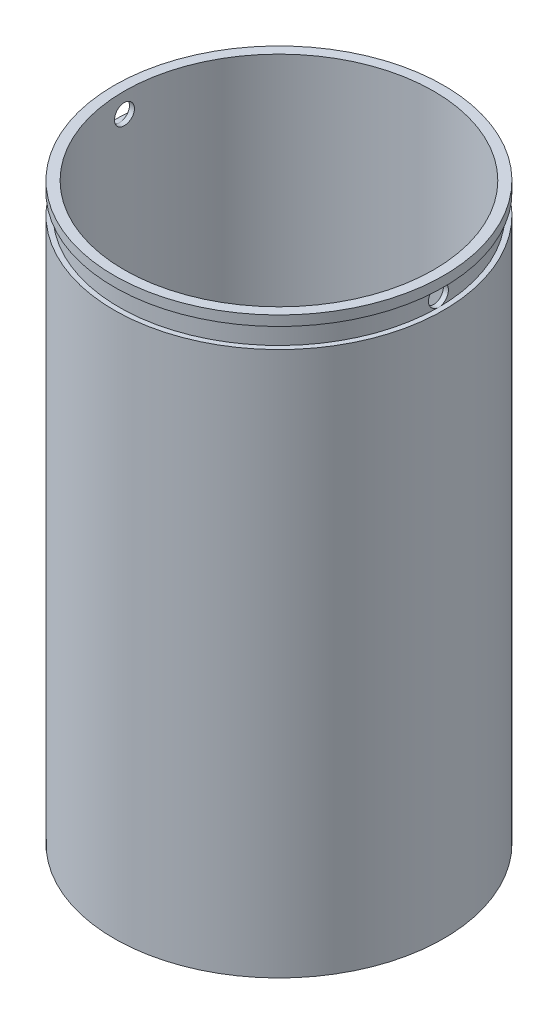
ISO-10303-21;
HEADER;
FILE_DESCRIPTION(('STEP AP214'),'2;1');
FILE_NAME('part.step','',(''),(''),'','','');
FILE_SCHEMA(('AUTOMOTIVE_DESIGN { 1 0 10303 214 1 1 1 1 }'));
ENDSEC;
DATA;
#1=APPLICATION_CONTEXT('core data for automotive mechanical design processes');
#2=APPLICATION_PROTOCOL_DEFINITION('international standard','automotive_design',2000,#1);
#3=PRODUCT_CONTEXT('',#1,'mechanical');
#4=PRODUCT('Part','Part','',(#3));
#5=PRODUCT_RELATED_PRODUCT_CATEGORY('part','',(#4));
#6=PRODUCT_DEFINITION_FORMATION('','',#4);
#7=PRODUCT_DEFINITION_CONTEXT('part definition',#1,'design');
#8=PRODUCT_DEFINITION('design','',#6,#7);
#9=PRODUCT_DEFINITION_SHAPE('','',#8);
#10=(LENGTH_UNIT() NAMED_UNIT(*) SI_UNIT(.MILLI.,.METRE.));
#11=(NAMED_UNIT(*) PLANE_ANGLE_UNIT() SI_UNIT($,.RADIAN.));
#12=(NAMED_UNIT(*) SI_UNIT($,.STERADIAN.) SOLID_ANGLE_UNIT());
#13=UNCERTAINTY_MEASURE_WITH_UNIT(LENGTH_MEASURE(1.E-05),#10,'distance_accuracy_value','');
#14=(GEOMETRIC_REPRESENTATION_CONTEXT(3) GLOBAL_UNCERTAINTY_ASSIGNED_CONTEXT((#13)) GLOBAL_UNIT_ASSIGNED_CONTEXT((#10,
#11,#12)) REPRESENTATION_CONTEXT('',''));
#15=CARTESIAN_POINT('',(0.,0.,0.));
#16=DIRECTION('',(0.,0.,1.));
#17=DIRECTION('',(1.,0.,0.));
#18=AXIS2_PLACEMENT_3D('',#15,#16,#17);
#19=CARTESIAN_POINT('',(33.,183.335721316873,0.));
#20=DIRECTION('',(0.,1.,0.));
#21=DIRECTION('',(-1.,0.,0.));
#22=AXIS2_PLACEMENT_3D('',#19,#20,#21);
#23=CYLINDRICAL_SURFACE('',#22,32.);
#24=CARTESIAN_POINT('',(1.,109.,0.));
#25=CARTESIAN_POINT('',(0.999999171304744,109.000000308421,0.0562097615213053));
#26=CARTESIAN_POINT('',(1.0001482916857,109.002371140767,0.112392540361131));
#27=CARTESIAN_POINT('',(1.00073764348725,109.011828929291,0.224355018081474));
#28=CARTESIAN_POINT('',(1.00117785888025,109.018915625815,0.280134738983286));
#29=CARTESIAN_POINT('',(1.00292004504432,109.047180908096,0.446169295385502));
#30=CARTESIAN_POINT('',(1.00464361345114,109.075364880131,0.555310233473228));
#31=CARTESIAN_POINT('',(1.009024136606,109.149623227726,0.767295237480026));
#32=CARTESIAN_POINT('',(1.01168149271763,109.195705297201,0.870136573327341));
#33=CARTESIAN_POINT('',(1.01763017690025,109.304442505608,1.06662221408599));
#34=CARTESIAN_POINT('',(1.02092139916089,109.367094879133,1.16026805005494));
#35=CARTESIAN_POINT('',(1.02777306781965,109.507288486095,1.33583304530606));
#36=CARTESIAN_POINT('',(1.03133384141347,109.584847996125,1.41773759196393));
#37=CARTESIAN_POINT('',(1.03832095609111,109.75262731763,1.5673859055091));
#38=CARTESIAN_POINT('',(1.04174727662157,109.842849055163,1.63512751415415));
#39=CARTESIAN_POINT('',(1.04808126042793,110.033471023754,1.75456031816851));
#40=CARTESIAN_POINT('',(1.05098851621967,110.133879155371,1.80623892688856));
#41=CARTESIAN_POINT('',(1.05595191847097,110.341961864688,1.89199570655141));
#42=CARTESIAN_POINT('',(1.05800812624102,110.449635918293,1.92607514540268));
#43=CARTESIAN_POINT('',(1.0610345201514,110.669051168474,1.9756280173657));
#44=CARTESIAN_POINT('',(1.06200611514267,110.780786893793,1.99112558922093));
#45=CARTESIAN_POINT('',(1.06275793863371,111.00528048899,2.00314941824766));
#46=CARTESIAN_POINT('',(1.0625381512474,111.118038372477,1.99967542244937));
#47=CARTESIAN_POINT('',(1.06093326241184,111.341204760313,1.97387409524364));
#48=CARTESIAN_POINT('',(1.05954981012138,111.451616362917,1.95157344501521));
#49=CARTESIAN_POINT('',(1.05577610206129,111.667125471084,1.88879329643751));
#50=CARTESIAN_POINT('',(1.05338584482158,111.772222968888,1.84831377154453));
#51=CARTESIAN_POINT('',(1.04786593646862,111.974208805135,1.75029374605889));
#52=CARTESIAN_POINT('',(1.04473574579549,112.071091082658,1.6927407876635));
#53=CARTESIAN_POINT('',(1.03808945303484,112.25382494648,1.5622193438104));
#54=CARTESIAN_POINT('',(1.03457336482079,112.33967692909,1.48925141245176));
#55=CARTESIAN_POINT('',(1.02754456797864,112.498062188962,1.3298329659796));
#56=CARTESIAN_POINT('',(1.02403187350124,112.570574177057,1.24336130002778));
#57=CARTESIAN_POINT('',(1.0174099176824,112.700078381704,1.05942654057051));
#58=CARTESIAN_POINT('',(1.01430078256342,112.757065748669,0.961960025904426));
#59=CARTESIAN_POINT('',(1.00883570767345,112.853898743032,0.758776867874263));
#60=CARTESIAN_POINT('',(1.00648026098146,112.893733154468,0.653054879630583));
#61=CARTESIAN_POINT('',(1.00279463276695,112.955019833372,0.436486554014165));
#62=CARTESIAN_POINT('',(1.00146289192431,112.976500063724,0.325648283931003));
#63=CARTESIAN_POINT('',(1.00047715907886,112.992352036972,0.178381744620211));
#64=CARTESIAN_POINT('',(1.00029832216219,112.995221505432,0.142734520830933));
#65=CARTESIAN_POINT('',(1.00005989779759,112.999042878148,0.0713963987026803));
#66=CARTESIAN_POINT('',(1.00000011266863,112.999997961185,0.0357056713931027));
#67=CARTESIAN_POINT('',(1.,113.,0.));
#68=B_SPLINE_CURVE_WITH_KNOTS('',3,(#24,#25,#26,#27,#28,#29,#30,#31,#32,#33,#34,#35,#36,#37,#38,
#39,#40,#41,#42,#43,#44,#45,#46,#47,#48,#49,#50,#51,#52,#53,#54,#55,#56,#57,#58,#59,#60,#61,#62,
#63,#64,#65,#66,#67),.UNSPECIFIED.,.F.,.F.,(4,2,2,2,2,2,2,2,2,2,2,2,2,2,2,2,2,2,2,2,2,4),(0.,
0.168525538289541,0.337041798396648,0.673509484908622,1.01012197027873,1.34667831404533,
1.68364994879323,2.02067289614213,2.35795926611283,2.69522133335051,3.03204480453641,
3.36887276698884,3.70522417584694,4.04157607582703,4.37817400454637,4.71475983613971,
5.05187824835549,5.38910184930619,5.72654562016035,6.06347436877324,6.17072692216127,
6.27780123770154),.UNSPECIFIED.);
#69=CARTESIAN_POINT('',(1.,109.,0.));
#70=VERTEX_POINT('',#69);
#71=CARTESIAN_POINT('',(1.,113.,0.));
#72=VERTEX_POINT('',#71);
#73=EDGE_CURVE('E56',#70,#72,#68,.T.);
#74=ORIENTED_EDGE('',*,*,#73,.F.);
#75=CARTESIAN_POINT('',(33.,109.,0.));
#76=DIRECTION('',(0.,1.,0.));
#77=DIRECTION('',(-1.,0.,0.));
#78=AXIS2_PLACEMENT_3D('',#75,#76,#77);
#79=CIRCLE('',#78,32.);
#80=CARTESIAN_POINT('',(65.,109.,0.));
#81=VERTEX_POINT('',#80);
#82=EDGE_CURVE('E73',#70,#81,#79,.T.);
#83=ORIENTED_EDGE('',*,*,#82,.T.);
#84=CARTESIAN_POINT('',(65.,113.,0.));
#85=CARTESIAN_POINT('',(64.9999991691436,112.999995062177,0.112223346836729));
#86=CARTESIAN_POINT('',(64.9994033390944,112.99052270053,0.224525271712994));
#87=CARTESIAN_POINT('',(64.9970837372355,112.952871532295,0.446028210718384));
#88=CARTESIAN_POINT('',(64.995358652637,112.924670953097,0.555225461224794));
#89=CARTESIAN_POINT('',(64.9909756950359,112.850376498271,0.767278508187789));
#90=CARTESIAN_POINT('',(64.9883183141517,112.804292061388,0.870137616661275));
#91=CARTESIAN_POINT('',(64.9823696449571,112.695553359115,1.06663341580872));
#92=CARTESIAN_POINT('',(64.97907850187,112.632902888519,1.16027221185356));
#93=CARTESIAN_POINT('',(64.9722267354338,112.49270769582,1.33583645868492));
#94=CARTESIAN_POINT('',(64.9686657620133,112.415143417273,1.41774628048157));
#95=CARTESIAN_POINT('',(64.9616786657649,112.247362665015,1.56739381033953));
#96=CARTESIAN_POINT('',(64.9582525485769,112.157145662874,1.63513092619534));
#97=CARTESIAN_POINT('',(64.9519188366027,111.966531917699,1.75455837247394));
#98=CARTESIAN_POINT('',(64.9490116620903,111.866127026123,1.80623572151365));
#99=CARTESIAN_POINT('',(64.9440482085556,111.658044755264,1.89199363600726));
#100=CARTESIAN_POINT('',(64.9419919203823,111.550367454206,1.92607439070512));
#101=CARTESIAN_POINT('',(64.9389654609923,111.330947472138,1.97562831743006));
#102=CARTESIAN_POINT('',(64.9379938610264,111.219210339645,1.99112596908517));
#103=CARTESIAN_POINT('',(64.9372420665942,110.994716721743,2.0031493359497));
#104=CARTESIAN_POINT('',(64.9374618586344,110.881960247894,1.99967526602792));
#105=CARTESIAN_POINT('',(64.9390667357904,110.65879549518,1.97387412170284));
#106=CARTESIAN_POINT('',(64.9404501834944,110.548384140137,1.95157353844043));
#107=CARTESIAN_POINT('',(64.9442238871793,110.332875005954,1.88879348852425));
#108=CARTESIAN_POINT('',(64.9466141491928,110.227777258658,1.84831391294731));
#109=CARTESIAN_POINT('',(64.9521339981319,110.025793579453,1.75029487225467));
#110=CARTESIAN_POINT('',(64.9552641055254,109.928913494015,1.6927433900599));
#111=CARTESIAN_POINT('',(64.9619103808454,109.746179129439,1.56222292166933));
#112=CARTESIAN_POINT('',(64.9654265531119,109.660324974273,1.48925376214585));
#113=CARTESIAN_POINT('',(64.9724559793486,109.501925423523,1.32982006299894));
#114=CARTESIAN_POINT('',(64.9759692179758,109.429403101631,1.24333259667534));
#115=CARTESIAN_POINT('',(64.982591062014,109.299903839853,1.05939772122562));
#116=CARTESIAN_POINT('',(64.9856996672838,109.242926905398,0.96195030827039));
#117=CARTESIAN_POINT('',(64.9911621980439,109.146137739819,0.758847722758274));
#118=CARTESIAN_POINT('',(64.99351608511,109.106326382594,0.653192132646817));
#119=CARTESIAN_POINT('',(64.9972034118695,109.045013884533,0.436678621420566));
#120=CARTESIAN_POINT('',(64.9985368634802,109.023512529859,0.325820761078042));
#121=CARTESIAN_POINT('',(65.0000315242478,108.999458972764,0.102249754998171));
#122=CARTESIAN_POINT('',(65.0001947068988,108.996874868906,-0.0104599459167942));
#123=CARTESIAN_POINT('',(64.9993356906232,109.010645813266,-0.234711212096934));
#124=CARTESIAN_POINT('',(64.9983134978653,109.027000762925,-0.346252783437983));
#125=CARTESIAN_POINT('',(64.9952000745992,109.078159142727,-0.564911662206108));
#126=CARTESIAN_POINT('',(64.9931096922732,109.112947936523,-0.672032407107904));
#127=CARTESIAN_POINT('',(64.9880950655264,109.199971611891,-0.878914962577337));
#128=CARTESIAN_POINT('',(64.9851708136059,109.252206650378,-0.978676706947322));
#129=CARTESIAN_POINT('',(64.9788121113869,109.372721261666,-1.16815547641269));
#130=CARTESIAN_POINT('',(64.9753769858254,109.441022140563,-1.25785892714608));
#131=CARTESIAN_POINT('',(64.9683853852037,109.591698608287,-1.4245381064233));
#132=CARTESIAN_POINT('',(64.964828908949,109.674074335692,-1.5015137096365));
#133=CARTESIAN_POINT('',(64.9579897332692,109.850699787918,-1.6406602009716));
#134=CARTESIAN_POINT('',(64.9547074206804,109.944965834429,-1.70281039277817));
#135=CARTESIAN_POINT('',(64.9487928812005,110.142614018748,-1.81040027298452));
#136=CARTESIAN_POINT('',(64.9461606503005,110.245996100335,-1.85584006443136));
#137=CARTESIAN_POINT('',(64.9418459068394,110.458866121272,-1.92868343817412));
#138=CARTESIAN_POINT('',(64.9401627084838,110.56834958858,-1.95610004685244));
#139=CARTESIAN_POINT('',(64.9379339446621,110.790376672896,-1.99216134169379));
#140=CARTESIAN_POINT('',(64.937388367905,110.902920259521,-2.00080621416729));
#141=CARTESIAN_POINT('',(64.9374966460887,111.127667083278,-1.99907684048124));
#142=CARTESIAN_POINT('',(64.9381484490252,111.239870573223,-1.98873513251053));
#143=CARTESIAN_POINT('',(64.9405736886462,111.460944612384,-1.94939362054261));
#144=CARTESIAN_POINT('',(64.9423471273629,111.569815155561,-1.92039378273976));
#145=CARTESIAN_POINT('',(64.946815285928,111.781137793918,-1.84456652625292));
#146=CARTESIAN_POINT('',(64.9495099991605,111.883589935184,-1.79773923559249));
#147=CARTESIAN_POINT('',(64.9555169893406,112.079182180891,-1.68759082343583));
#148=CARTESIAN_POINT('',(64.9588292502911,112.172322526451,-1.62427012917213));
#149=CARTESIAN_POINT('',(64.9657046929994,112.346812232374,-1.48281211963383));
#150=CARTESIAN_POINT('',(64.9692682672274,112.428142515055,-1.40465129170039));
#151=CARTESIAN_POINT('',(64.976241440984,112.576555780947,-1.23576309808776));
#152=CARTESIAN_POINT('',(64.9796510026267,112.643635273439,-1.14503266246554));
#153=CARTESIAN_POINT('',(64.9859354897034,112.761692220592,-0.95347744973206));
#154=CARTESIAN_POINT('',(64.9888097484528,112.812649650717,-0.852640322525295));
#155=CARTESIAN_POINT('',(64.9936907974328,112.896848434641,-0.643897015514742));
#156=CARTESIAN_POINT('',(64.9956986030929,112.930110536974,-0.535999282102365));
#157=CARTESIAN_POINT('',(64.9980943626532,112.969329448721,-0.356201216456019));
#158=CARTESIAN_POINT('',(64.9988058007412,112.980816032996,-0.285463079423701));
#159=CARTESIAN_POINT('',(64.9997588841249,112.996152878473,-0.143160621752727));
#160=CARTESIAN_POINT('',(65.0000005300701,113.000003150235,-0.0715963022564656));
#161=CARTESIAN_POINT('',(65.,113.,0.));
#162=B_SPLINE_CURVE_WITH_KNOTS('',3,(#84,#85,#86,#87,#88,#89,#90,#91,#92,#93,#94,#95,#96,#97,
#98,#99,#100,#101,#102,#103,#104,#105,#106,#107,#108,#109,#110,#111,#112,#113,#114,#115,#116,
#117,#118,#119,#120,#121,#122,#123,#124,#125,#126,#127,#128,#129,#130,#131,#132,#133,#134,#135,
#136,#137,#138,#139,#140,#141,#142,#143,#144,#145,#146,#147,#148,#149,#150,#151,#152,#153,#154,
#155,#156,#157,#158,#159,#160,#161),.UNSPECIFIED.,.T.,.F.,(4,2,2,2,2,2,2,2,2,2,2,2,2,2,2,2,2,2,
2,2,2,2,2,2,2,2,2,2,2,2,2,2,2,2,2,2,2,2,4),(0.,0.336408671473625,0.673209123258163,
1.00983205968327,1.34637795233538,1.68336820424855,2.02037253446431,2.35764856671475,
2.69492097162791,3.0317485958564,3.36857240527032,3.70492305202053,4.04127571411159,
4.37786570218285,4.71445947444746,5.05163042223774,5.38880148782713,5.72598971674316,
6.06317400764855,6.39978955065089,6.73640334192087,7.07275026373909,7.40910021078634,
7.7458987565046,8.08270061846788,8.41996994064656,8.75723718297115,9.09426039422935,
9.43128026049926,9.76772309914686,10.1041665473784,10.4406075795674,10.7770398977113,
11.1140097747179,11.451062097263,11.7885314296162,12.1256041876344,12.3402266427971,
12.5548488012288),.UNSPECIFIED.);
#163=CARTESIAN_POINT('',(65.,113.,0.));
#164=VERTEX_POINT('',#163);
#165=EDGE_CURVE('E49',#164,#81,#162,.T.);
#166=ORIENTED_EDGE('',*,*,#165,.F.);
#167=CARTESIAN_POINT('',(33.,113.,0.));
#168=DIRECTION('',(0.,1.,0.));
#169=DIRECTION('',(-1.,0.,0.));
#170=AXIS2_PLACEMENT_3D('',#167,#168,#169);
#171=CIRCLE('',#170,32.);
#172=EDGE_CURVE('E75',#72,#164,#171,.T.);
#173=ORIENTED_EDGE('',*,*,#172,.F.);
#174=EDGE_LOOP('',(#74,#83,#166,#173));
#175=FACE_BOUND('',#174,.T.);
#176=ADVANCED_FACE('F33',(#175),#23,.T.);
#177=CARTESIAN_POINT('',(33.,0.,0.));
#178=DIRECTION('',(0.,-1.,0.));
#179=DIRECTION('',(1.,0.,0.));
#180=AXIS2_PLACEMENT_3D('',#177,#178,#179);
#181=PLANE('',#180);
#182=CARTESIAN_POINT('',(54.2979531515138,0.,14.9129873451272));
#183=DIRECTION('',(0.,-1.,0.));
#184=DIRECTION('',(1.,0.,0.));
#185=AXIS2_PLACEMENT_3D('',#182,#183,#184);
#186=CIRCLE('',#185,3.5);
#187=CARTESIAN_POINT('',(57.7979531515138,0.,14.9129873451272));
#188=VERTEX_POINT('',#187);
#189=EDGE_CURVE('E222',#188,#188,#186,.T.);
#190=ORIENTED_EDGE('',*,*,#189,.F.);
#191=EDGE_LOOP('',(#190));
#192=FACE_BOUND('',#191,.T.);
#193=CARTESIAN_POINT('',(11.7020468484862,0.,-14.9129873451272));
#194=DIRECTION('',(0.,-1.,0.));
#195=DIRECTION('',(-1.,0.,0.));
#196=AXIS2_PLACEMENT_3D('',#193,#194,#195);
#197=CIRCLE('',#196,3.5);
#198=CARTESIAN_POINT('',(8.20204684848623,0.,-14.9129873451272));
#199=VERTEX_POINT('',#198);
#200=EDGE_CURVE('E224',#199,#199,#197,.T.);
#201=ORIENTED_EDGE('',*,*,#200,.F.);
#202=EDGE_LOOP('',(#201));
#203=FACE_BOUND('',#202,.T.);
#204=CARTESIAN_POINT('',(47.9129873451272,0.,-21.2979531515138));
#205=DIRECTION('',(0.,-1.,0.));
#206=DIRECTION('',(-1.,0.,0.));
#207=AXIS2_PLACEMENT_3D('',#204,#205,#206);
#208=CIRCLE('',#207,3.5);
#209=CARTESIAN_POINT('',(44.4129873451272,0.,-21.2979531515138));
#210=VERTEX_POINT('',#209);
#211=EDGE_CURVE('E229',#210,#210,#208,.T.);
#212=ORIENTED_EDGE('',*,*,#211,.F.);
#213=EDGE_LOOP('',(#212));
#214=FACE_BOUND('',#213,.T.);
#215=CARTESIAN_POINT('',(18.0870126548728,0.,21.2979531515138));
#216=DIRECTION('',(0.,-1.,0.));
#217=DIRECTION('',(1.,0.,0.));
#218=AXIS2_PLACEMENT_3D('',#215,#216,#217);
#219=CIRCLE('',#218,3.5);
#220=CARTESIAN_POINT('',(21.5870126548728,0.,21.2979531515138));
#221=VERTEX_POINT('',#220);
#222=EDGE_CURVE('E223',#221,#221,#219,.T.);
#223=ORIENTED_EDGE('',*,*,#222,.F.);
#224=EDGE_LOOP('',(#223));
#225=FACE_BOUND('',#224,.T.);
#226=CARTESIAN_POINT('',(33.,0.,0.));
#227=DIRECTION('',(0.,1.,0.));
#228=DIRECTION('',(-1.,0.,0.));
#229=AXIS2_PLACEMENT_3D('',#226,#227,#228);
#230=CIRCLE('',#229,33.);
#231=CARTESIAN_POINT('',(0.,0.,0.));
#232=VERTEX_POINT('',#231);
#233=EDGE_CURVE('E11',#232,#232,#230,.T.);
#234=ORIENTED_EDGE('',*,*,#233,.F.);
#235=EDGE_LOOP('',(#234));
#236=FACE_BOUND('',#235,.T.);
#237=ADVANCED_FACE('F35',(#192,#203,#214,#225,#236),#181,.T.);
#238=CARTESIAN_POINT('',(33.,183.335721316873,0.));
#239=DIRECTION('',(0.,1.,0.));
#240=DIRECTION('',(-1.,0.,0.));
#241=AXIS2_PLACEMENT_3D('',#238,#239,#240);
#242=CYLINDRICAL_SURFACE('',#241,33.);
#243=ORIENTED_EDGE('',*,*,#233,.T.);
#244=EDGE_LOOP('',(#243));
#245=FACE_BOUND('',#244,.T.);
#246=CARTESIAN_POINT('',(33.,109.,0.));
#247=DIRECTION('',(0.,1.,0.));
#248=DIRECTION('',(-1.,0.,0.));
#249=AXIS2_PLACEMENT_3D('',#246,#247,#248);
#250=CIRCLE('',#249,33.);
#251=CARTESIAN_POINT('',(0.,109.,0.));
#252=VERTEX_POINT('',#251);
#253=EDGE_CURVE('E42',#252,#252,#250,.T.);
#254=ORIENTED_EDGE('',*,*,#253,.F.);
#255=EDGE_LOOP('',(#254));
#256=FACE_BOUND('',#255,.T.);
#257=ADVANCED_FACE('F142',(#245,#256),#242,.T.);
#258=CARTESIAN_POINT('',(0.,109.,0.));
#259=DIRECTION('',(0.,1.,0.));
#260=DIRECTION('',(-1.,0.,0.));
#261=AXIS2_PLACEMENT_3D('',#258,#259,#260);
#262=PLANE('',#261);
#263=ORIENTED_EDGE('',*,*,#253,.T.);
#264=EDGE_LOOP('',(#263));
#265=FACE_BOUND('',#264,.T.);
#266=ORIENTED_EDGE('',*,*,#82,.F.);
#267=EDGE_CURVE('E79',#81,#70,#79,.T.);
#268=ORIENTED_EDGE('',*,*,#267,.F.);
#269=EDGE_LOOP('',(#266,#268));
#270=FACE_BOUND('',#269,.T.);
#271=ADVANCED_FACE('F84',(#265,#270),#262,.T.);
#272=CARTESIAN_POINT('',(1.,113.,0.));
#273=CARTESIAN_POINT('',(0.999999171304747,112.999999691579,-0.056209761521305));
#274=CARTESIAN_POINT('',(1.0001482916857,112.997628859233,-0.112392540361131));
#275=CARTESIAN_POINT('',(1.00073764348725,112.988171070709,-0.224355018081473));
#276=CARTESIAN_POINT('',(1.00117785888025,112.981084374185,-0.280134738983284));
#277=CARTESIAN_POINT('',(1.00292004504432,112.952819091904,-0.4461692953855));
#278=CARTESIAN_POINT('',(1.00464361345114,112.924635119869,-0.555310233473226));
#279=CARTESIAN_POINT('',(1.00902413660601,112.850376772274,-0.76729523748003));
#280=CARTESIAN_POINT('',(1.01168149271764,112.804294702799,-0.87013657332735));
#281=CARTESIAN_POINT('',(1.01763017690025,112.695557494392,-1.066622214086));
#282=CARTESIAN_POINT('',(1.02092139916089,112.632905120867,-1.16026805005494));
#283=CARTESIAN_POINT('',(1.02777306781965,112.492711513905,-1.33583304530605));
#284=CARTESIAN_POINT('',(1.03133384141346,112.415152003875,-1.41773759196393));
#285=CARTESIAN_POINT('',(1.03832095609111,112.24737268237,-1.5673859055091));
#286=CARTESIAN_POINT('',(1.04174727662157,112.157150944837,-1.63512751415415));
#287=CARTESIAN_POINT('',(1.04808126042794,111.966528976246,-1.75456031816851));
#288=CARTESIAN_POINT('',(1.05098851621967,111.866120844629,-1.80623892688856));
#289=CARTESIAN_POINT('',(1.05595191847097,111.658038135312,-1.89199570655141));
#290=CARTESIAN_POINT('',(1.05800812624103,111.550364081707,-1.92607514540268));
#291=CARTESIAN_POINT('',(1.0610345201514,111.330948831526,-1.9756280173657));
#292=CARTESIAN_POINT('',(1.06200611514267,111.219213106207,-1.99112558922093));
#293=CARTESIAN_POINT('',(1.06275793863371,110.99471951101,-2.00314941824766));
#294=CARTESIAN_POINT('',(1.0625381512474,110.881961627523,-1.99967542244937));
#295=CARTESIAN_POINT('',(1.06093326241184,110.658795239687,-1.97387409524364));
#296=CARTESIAN_POINT('',(1.05954981012138,110.548383637083,-1.95157344501521));
#297=CARTESIAN_POINT('',(1.05577610206129,110.332874528916,-1.88879329643751));
#298=CARTESIAN_POINT('',(1.05338584482159,110.227777031112,-1.84831377154453));
#299=CARTESIAN_POINT('',(1.04786593646863,110.025791194865,-1.75029374605889));
#300=CARTESIAN_POINT('',(1.04473574579549,109.928908917342,-1.6927407876635));
#301=CARTESIAN_POINT('',(1.03808945303485,109.74617505352,-1.5622193438104));
#302=CARTESIAN_POINT('',(1.0345733648208,109.66032307091,-1.48925141245175));
#303=CARTESIAN_POINT('',(1.02754456797865,109.501937811038,-1.3298329659796));
#304=CARTESIAN_POINT('',(1.02403187350123,109.429425822943,-1.24336130002778));
#305=CARTESIAN_POINT('',(1.01740991768239,109.299921618296,-1.05942654057051));
#306=CARTESIAN_POINT('',(1.01430078256342,109.242934251331,-0.961960025904426));
#307=CARTESIAN_POINT('',(1.00883570767345,109.146101256968,-0.758776867874263));
#308=CARTESIAN_POINT('',(1.00648026098146,109.106266845532,-0.653054879630583));
#309=CARTESIAN_POINT('',(1.00279463276696,109.044980166628,-0.436486554014165));
#310=CARTESIAN_POINT('',(1.00146289192432,109.023499936276,-0.325648283931003));
#311=CARTESIAN_POINT('',(1.00047715907886,109.007647963028,-0.178381744620211));
#312=CARTESIAN_POINT('',(1.00029832216219,109.004778494568,-0.142734520830933));
#313=CARTESIAN_POINT('',(1.00005989779759,109.000957121852,-0.0713963987026803));
#314=CARTESIAN_POINT('',(1.00000011266862,109.000002038815,-0.0357056713931026));
#315=CARTESIAN_POINT('',(0.999999999999999,109.,0.));
#316=B_SPLINE_CURVE_WITH_KNOTS('',3,(#272,#273,#274,#275,#276,#277,#278,#279,#280,#281,#282,
#283,#284,#285,#286,#287,#288,#289,#290,#291,#292,#293,#294,#295,#296,#297,#298,#299,#300,#301,
#302,#303,#304,#305,#306,#307,#308,#309,#310,#311,#312,#313,#314,#315),.UNSPECIFIED.,.F.,.F.,(4,
2,2,2,2,2,2,2,2,2,2,2,2,2,2,2,2,2,2,2,2,4),(0.,0.16852553828954,0.337041798396645,
0.673509484908622,1.01012197027874,1.34667831404533,1.68364994879321,2.02067289614214,
2.35795926611285,2.69522133335051,3.03204480453641,3.36887276698884,3.70522417584694,
4.04157607582703,4.37817400454639,4.71475983613971,5.05187824835549,5.38910184930619,
5.72654562016035,6.06347436877324,6.17072692216127,6.27780123770154),.UNSPECIFIED.);
#317=EDGE_CURVE('E61',#72,#70,#316,.T.);
#318=ORIENTED_EDGE('',*,*,#317,.F.);
#319=EDGE_CURVE('E268',#164,#72,#171,.T.);
#320=ORIENTED_EDGE('',*,*,#319,.F.);
#321=EDGE_CURVE('E81',#81,#164,#162,.T.);
#322=ORIENTED_EDGE('',*,*,#321,.F.);
#323=ORIENTED_EDGE('',*,*,#267,.T.);
#324=EDGE_LOOP('',(#318,#320,#322,#323));
#325=FACE_BOUND('',#324,.T.);
#326=ADVANCED_FACE('F80',(#325),#23,.T.);
#327=CARTESIAN_POINT('',(1.,113.,0.));
#328=DIRECTION('',(0.,-1.,0.));
#329=DIRECTION('',(1.,0.,0.));
#330=AXIS2_PLACEMENT_3D('',#327,#328,#329);
#331=PLANE('',#330);
#332=ORIENTED_EDGE('',*,*,#172,.T.);
#333=ORIENTED_EDGE('',*,*,#319,.T.);
#334=EDGE_LOOP('',(#332,#333));
#335=FACE_BOUND('',#334,.T.);
#336=CARTESIAN_POINT('',(33.,113.,0.));
#337=DIRECTION('',(0.,1.,0.));
#338=DIRECTION('',(-1.,0.,0.));
#339=AXIS2_PLACEMENT_3D('',#336,#337,#338);
#340=CIRCLE('',#339,33.);
#341=CARTESIAN_POINT('',(0.,113.,0.));
#342=VERTEX_POINT('',#341);
#343=EDGE_CURVE('E263',#342,#342,#340,.T.);
#344=ORIENTED_EDGE('',*,*,#343,.F.);
#345=EDGE_LOOP('',(#344));
#346=FACE_BOUND('',#345,.T.);
#347=ADVANCED_FACE('F137',(#335,#346),#331,.T.);
#348=CARTESIAN_POINT('',(33.,183.335721316873,0.));
#349=DIRECTION('',(0.,1.,0.));
#350=DIRECTION('',(-1.,0.,0.));
#351=AXIS2_PLACEMENT_3D('',#348,#349,#350);
#352=CYLINDRICAL_SURFACE('',#351,33.);
#353=ORIENTED_EDGE('',*,*,#343,.T.);
#354=EDGE_LOOP('',(#353));
#355=FACE_BOUND('',#354,.T.);
#356=CARTESIAN_POINT('',(33.,115.,0.));
#357=DIRECTION('',(0.,1.,0.));
#358=DIRECTION('',(-1.,0.,0.));
#359=AXIS2_PLACEMENT_3D('',#356,#357,#358);
#360=CIRCLE('',#359,33.);
#361=CARTESIAN_POINT('',(0.,115.,0.));
#362=VERTEX_POINT('',#361);
#363=EDGE_CURVE('E261',#362,#362,#360,.T.);
#364=ORIENTED_EDGE('',*,*,#363,.F.);
#365=EDGE_LOOP('',(#364));
#366=FACE_BOUND('',#365,.T.);
#367=ADVANCED_FACE('F274',(#355,#366),#352,.T.);
#368=CARTESIAN_POINT('',(0.,115.,0.));
#369=DIRECTION('',(0.,1.,0.));
#370=DIRECTION('',(-1.,0.,0.));
#371=AXIS2_PLACEMENT_3D('',#368,#369,#370);
#372=PLANE('',#371);
#373=CARTESIAN_POINT('',(33.,115.,0.));
#374=DIRECTION('',(0.,1.,0.));
#375=DIRECTION('',(-1.,0.,0.));
#376=AXIS2_PLACEMENT_3D('',#373,#374,#375);
#377=CIRCLE('',#376,31.);
#378=CARTESIAN_POINT('',(1.99999999999999,115.,0.));
#379=VERTEX_POINT('',#378);
#380=EDGE_CURVE('E76',#379,#379,#377,.T.);
#381=ORIENTED_EDGE('',*,*,#380,.F.);
#382=EDGE_LOOP('',(#381));
#383=FACE_BOUND('',#382,.T.);
#384=ORIENTED_EDGE('',*,*,#363,.T.);
#385=EDGE_LOOP('',(#384));
#386=FACE_BOUND('',#385,.T.);
#387=ADVANCED_FACE('F278',(#383,#386),#372,.T.);
#388=CARTESIAN_POINT('',(33.,2.00000000000002,0.));
#389=DIRECTION('',(0.,1.,0.));
#390=DIRECTION('',(-1.,0.,0.));
#391=AXIS2_PLACEMENT_3D('',#388,#389,#390);
#392=CYLINDRICAL_SURFACE('',#391,31.);
#393=CARTESIAN_POINT('',(2.,109.,0.));
#394=CARTESIAN_POINT('',(2.00000085664072,109.000004934643,0.112215654339317));
#395=CARTESIAN_POINT('',(2.0006158218622,109.009476003071,0.224509697755792));
#396=CARTESIAN_POINT('',(2.00300991773016,109.047121734763,0.445996563839363));
#397=CARTESIAN_POINT('',(2.004790400288,109.075318118519,0.555185631317145));
#398=CARTESIAN_POINT('',(2.00931412876657,109.149600777331,0.767222273353347));
#399=CARTESIAN_POINT('',(2.01205686362978,109.195677557385,0.870073180121541));
#400=CARTESIAN_POINT('',(2.01819669168551,109.304397525674,1.06655419121176));
#401=CARTESIAN_POINT('',(2.02159363580736,109.367036941092,1.16018638881332));
#402=CARTESIAN_POINT('',(2.02866613214849,109.507212783107,1.33574735149226));
#403=CARTESIAN_POINT('',(2.03234206769129,109.584769938928,1.41765955134848));
#404=CARTESIAN_POINT('',(2.03955498056145,109.752536840639,1.56731361668946));
#405=CARTESIAN_POINT('',(2.04309195205292,109.842747117181,1.63505488757192));
#406=CARTESIAN_POINT('',(2.0496310446858,110.033354123228,1.75449583012475));
#407=CARTESIAN_POINT('',(2.05263270280523,110.133759554425,1.80618164293254));
#408=CARTESIAN_POINT('',(2.05775767510353,110.341845759129,1.89195583963109));
#409=CARTESIAN_POINT('',(2.05988099923675,110.449526450167,1.92604442295615));
#410=CARTESIAN_POINT('',(2.0630061836293,110.668946110269,1.97561027708406));
#411=CARTESIAN_POINT('',(2.06400961540725,110.780679164679,1.99111363037516));
#412=CARTESIAN_POINT('',(2.06478656275248,111.005165886776,2.00314946286492));
#413=CARTESIAN_POINT('',(2.06456009301931,111.117919542249,1.99968216879705));
#414=CARTESIAN_POINT('',(2.06290423516468,111.341068993309,1.97389676609058));
#415=CARTESIAN_POINT('',(2.06147664880536,111.451468066746,1.95160689250421));
#416=CARTESIAN_POINT('',(2.05758227146169,111.666954436313,1.88885285922539));
#417=CARTESIAN_POINT('',(2.05511547391783,111.77204169891,1.84838858481581));
#418=CARTESIAN_POINT('',(2.04941858813695,111.974012051524,1.75040236603017));
#419=CARTESIAN_POINT('',(2.04618792766359,112.070888916575,1.69286762529808));
#420=CARTESIAN_POINT('',(2.03932795311776,112.253620437545,1.56238294303282));
#421=CARTESIAN_POINT('',(2.03569863426034,112.33947496114,1.48943281646508));
#422=CARTESIAN_POINT('',(2.02844233387844,112.497888972247,1.33002918024156));
#423=CARTESIAN_POINT('',(2.02481536874621,112.570423876577,1.24355123701299));
#424=CARTESIAN_POINT('',(2.01797887413968,112.699949989408,1.05963238065177));
#425=CARTESIAN_POINT('',(2.01476934482034,112.756941192139,0.96219146344964));
#426=CARTESIAN_POINT('',(2.00912910154634,112.853760095363,0.759097650104714));
#427=CARTESIAN_POINT('',(2.00669843044597,112.893586851477,0.653444302495539));
#428=CARTESIAN_POINT('',(2.00289036987973,112.954929837198,0.436931457046572));
#429=CARTESIAN_POINT('',(2.00151296730826,112.976446294637,0.326072024003268));
#430=CARTESIAN_POINT('',(1.99996834135037,113.000527417911,0.102507175447051));
#431=CARTESIAN_POINT('',(1.9997989477948,113.003126069462,-0.0101945649866303));
#432=CARTESIAN_POINT('',(2.00068365340261,112.989386633632,-0.234432325673384));
#433=CARTESIAN_POINT('',(2.00173774577541,112.973048651355,-0.345968352392933));
#434=CARTESIAN_POINT('',(2.00494937244791,112.921927865902,-0.564612747016004));
#435=CARTESIAN_POINT('',(2.00710597306986,112.887160668902,-0.671724778633494));
#436=CARTESIAN_POINT('',(2.01228002245135,112.800184225352,-0.878593779219432));
#437=CARTESIAN_POINT('',(2.01529747945621,112.747974811738,-0.978350677728698));
#438=CARTESIAN_POINT('',(2.02185966539343,112.627509547692,-1.16783322973209));
#439=CARTESIAN_POINT('',(2.02540513703646,112.559231014483,-1.25754443633822));
#440=CARTESIAN_POINT('',(2.03262191146299,112.408598683482,-1.42424356495626));
#441=CARTESIAN_POINT('',(2.03629321556418,112.326244738261,-1.50123135368357));
#442=CARTESIAN_POINT('',(2.04335417148636,112.149652611081,-1.64041349295417));
#443=CARTESIAN_POINT('',(2.04674339848825,112.05539702354,-1.7025857840609));
#444=CARTESIAN_POINT('',(2.05285121202053,111.857764592436,-1.81022116069945));
#445=CARTESIAN_POINT('',(2.05556980290595,111.754387808111,-1.85568435473854));
#446=CARTESIAN_POINT('',(2.0600266907406,111.541527836801,-1.92857285757611));
#447=CARTESIAN_POINT('',(2.06176574035172,111.432049409492,-1.95601201841901));
#448=CARTESIAN_POINT('',(2.0640695123967,111.210027804712,-1.99211878627912));
#449=CARTESIAN_POINT('',(2.06463424739778,111.097484660052,-2.00078659418242));
#450=CARTESIAN_POINT('',(2.06452539887316,110.87274763852,-1.99910264494747));
#451=CARTESIAN_POINT('',(2.06385407318427,110.760553499063,-1.98878556636567));
#452=CARTESIAN_POINT('',(2.06135353711399,110.539494180305,-1.94949664150648));
#453=CARTESIAN_POINT('',(2.0595243246576,110.430629006971,-1.9205247617985));
#454=CARTESIAN_POINT('',(2.05491470407079,110.219312946587,-1.84475653861325));
#455=CARTESIAN_POINT('',(2.05213430588964,110.116861992459,-1.79796038157477));
#456=CARTESIAN_POINT('',(2.04593567325452,109.921266379325,-1.68787663618788));
#457=CARTESIAN_POINT('',(2.04251745476997,109.828121487408,-1.62458946071717));
#458=CARTESIAN_POINT('',(2.03542107614507,109.653605959162,-1.48319164247165));
#459=CARTESIAN_POINT('',(2.03174248168123,109.572255720332,-1.40505584730704));
#460=CARTESIAN_POINT('',(2.02454360837828,109.423798047861,-1.23621411924609));
#461=CARTESIAN_POINT('',(2.0210233684559,109.356694100436,-1.14550511850991));
#462=CARTESIAN_POINT('',(2.01453399720269,109.238581091293,-0.9539826796621));
#463=CARTESIAN_POINT('',(2.01156558193983,109.187592882733,-0.853156370464061));
#464=CARTESIAN_POINT('',(2.00652381619834,109.103331518375,-0.644427767747335));
#465=CARTESIAN_POINT('',(2.00444941961744,109.070037647517,-0.536533915357344));
#466=CARTESIAN_POINT('',(2.00197209962646,109.030748752958,-0.356651594381855));
#467=CARTESIAN_POINT('',(2.00123585564285,109.019232915639,-0.285825407491098));
#468=CARTESIAN_POINT('',(2.00024953256235,109.003856968615,-0.143343476839128));
#469=CARTESIAN_POINT('',(1.99999945274451,108.999996847558,-0.0716877343082427));
#470=CARTESIAN_POINT('',(2.,109.,0.));
#471=B_SPLINE_CURVE_WITH_KNOTS('',3,(#393,#394,#395,#396,#397,#398,#399,#400,#401,#402,#403,
#404,#405,#406,#407,#408,#409,#410,#411,#412,#413,#414,#415,#416,#417,#418,#419,#420,#421,#422,
#423,#424,#425,#426,#427,#428,#429,#430,#431,#432,#433,#434,#435,#436,#437,#438,#439,#440,#441,
#442,#443,#444,#445,#446,#447,#448,#449,#450,#451,#452,#453,#454,#455,#456,#457,#458,#459,#460,
#461,#462,#463,#464,#465,#466,#467,#468,#469,#470),.UNSPECIFIED.,.T.,.F.,(4,2,2,2,2,2,2,2,2,2,2,
2,2,2,2,2,2,2,2,2,2,2,2,2,2,2,2,2,2,2,2,2,2,2,2,2,2,2,4),(0.,0.336385257264422,0.67316138883954,
1.00975892684097,1.34627985697647,1.68327182913147,2.02027793839952,2.35757414376297,
2.69486652637057,3.031684997043,3.36849944213589,3.70480954006274,4.04112176081473,
4.37768672750882,4.71425573430236,5.05143981525635,5.38862402137423,5.72582677682908,
6.06302533646995,6.39961797126436,6.73620873791161,7.07251492800511,7.40882433935654,
7.74561135475004,8.08240189794395,8.41969081298249,8.75697753766028,9.09400474250683,
9.43102834055903,9.7674369287722,10.1038461198529,10.4402517922498,10.7766490430285,
11.113621287119,11.450675897049,11.7881648741284,12.1252578719076,12.3401542056707,
12.5550502207584),.UNSPECIFIED.);
#472=CARTESIAN_POINT('',(2.,109.,0.));
#473=VERTEX_POINT('',#472);
#474=EDGE_CURVE('E98',#473,#473,#471,.T.);
#475=ORIENTED_EDGE('',*,*,#474,.T.);
#476=EDGE_LOOP('',(#475));
#477=FACE_BOUND('',#476,.T.);
#478=CARTESIAN_POINT('',(64.,113.,0.));
#479=CARTESIAN_POINT('',(63.9999991433593,112.999995065357,0.112215654339317));
#480=CARTESIAN_POINT('',(63.9993841781378,112.990523996929,0.224509697755794));
#481=CARTESIAN_POINT('',(63.9969900822698,112.952878265237,0.445996563839365));
#482=CARTESIAN_POINT('',(63.995209599712,112.924681881481,0.555185631317145));
#483=CARTESIAN_POINT('',(63.9906858712334,112.850399222669,0.767222273353342));
#484=CARTESIAN_POINT('',(63.9879431363702,112.804322442615,0.870073180121531));
#485=CARTESIAN_POINT('',(63.9818033083145,112.695602474326,1.06655419121175));
#486=CARTESIAN_POINT('',(63.9784063641927,112.632963058908,1.16018638881331));
#487=CARTESIAN_POINT('',(63.9713338678515,112.492787216893,1.33574735149226));
#488=CARTESIAN_POINT('',(63.9676579323087,112.415230061072,1.41765955134849));
#489=CARTESIAN_POINT('',(63.9604450194386,112.247463159361,1.56731361668946));
#490=CARTESIAN_POINT('',(63.9569080479471,112.157252882819,1.63505488757192));
#491=CARTESIAN_POINT('',(63.9503689553142,111.966645876772,1.75449583012476));
#492=CARTESIAN_POINT('',(63.9473672971948,111.866240445575,1.80618164293255));
#493=CARTESIAN_POINT('',(63.9422423248965,111.658154240871,1.89195583963109));
#494=CARTESIAN_POINT('',(63.9401190007633,111.550473549833,1.92604442295615));
#495=CARTESIAN_POINT('',(63.9369938163707,111.331053889731,1.97561027708406));
#496=CARTESIAN_POINT('',(63.9359903845928,111.219320835321,1.99111363037516));
#497=CARTESIAN_POINT('',(63.9352134372475,110.994834113224,2.00314946286492));
#498=CARTESIAN_POINT('',(63.9354399069807,110.882080457751,1.99968216879705));
#499=CARTESIAN_POINT('',(63.9370957648353,110.658931006691,1.97389676609058));
#500=CARTESIAN_POINT('',(63.9385233511946,110.548531933254,1.9516068925042));
#501=CARTESIAN_POINT('',(63.9424177285383,110.333045563687,1.88885285922539));
#502=CARTESIAN_POINT('',(63.9448845260822,110.22795830109,1.84838858481581));
#503=CARTESIAN_POINT('',(63.9505814118631,110.025987948476,1.75040236603017));
#504=CARTESIAN_POINT('',(63.9538120723364,109.929111083425,1.69286762529808));
#505=CARTESIAN_POINT('',(63.9606720468822,109.746379562455,1.56238294303281));
#506=CARTESIAN_POINT('',(63.9643013657397,109.66052503886,1.48943281646507));
#507=CARTESIAN_POINT('',(63.9715576661216,109.502111027753,1.33002918024156));
#508=CARTESIAN_POINT('',(63.9751846312538,109.429576123423,1.24355123701299));
#509=CARTESIAN_POINT('',(63.9820211258603,109.300050010592,1.05963238065177));
#510=CARTESIAN_POINT('',(63.9852306551797,109.243058807861,0.962191463449638));
#511=CARTESIAN_POINT('',(63.9908708984537,109.146239904637,0.759097650104709));
#512=CARTESIAN_POINT('',(63.993301569554,109.106413148523,0.653444302495536));
#513=CARTESIAN_POINT('',(63.9971096301203,109.045070162802,0.43693145704657));
#514=CARTESIAN_POINT('',(63.9984870326917,109.023553705363,0.326072024003263));
#515=CARTESIAN_POINT('',(64.0000316586496,108.999472582089,0.102507175447044));
#516=CARTESIAN_POINT('',(64.0002010522052,108.996873930538,-0.0101945649866368));
#517=CARTESIAN_POINT('',(63.9993163465974,109.010613366368,-0.23443232567339));
#518=CARTESIAN_POINT('',(63.9982622542246,109.026951348645,-0.345968352392938));
#519=CARTESIAN_POINT('',(63.9950506275521,109.078072134098,-0.564612747016008));
#520=CARTESIAN_POINT('',(63.9928940269301,109.112839331098,-0.671724778633499));
#521=CARTESIAN_POINT('',(63.9877199775486,109.199815774648,-0.878593779219437));
#522=CARTESIAN_POINT('',(63.9847025205438,109.252025188262,-0.978350677728702));
#523=CARTESIAN_POINT('',(63.9781403346066,109.372490452308,-1.1678332297321));
#524=CARTESIAN_POINT('',(63.9745948629635,109.440768985517,-1.25754443633823));
#525=CARTESIAN_POINT('',(63.967378088537,109.591401316518,-1.42424356495627));
#526=CARTESIAN_POINT('',(63.9637067844358,109.673755261739,-1.50123135368358));
#527=CARTESIAN_POINT('',(63.9566458285136,109.850347388919,-1.64041349295417));
#528=CARTESIAN_POINT('',(63.9532566015118,109.94460297646,-1.7025857840609));
#529=CARTESIAN_POINT('',(63.9471487879795,110.142235407564,-1.81022116069945));
#530=CARTESIAN_POINT('',(63.9444301970941,110.245612191889,-1.85568435473854));
#531=CARTESIAN_POINT('',(63.9399733092594,110.458472163199,-1.92857285757612));
#532=CARTESIAN_POINT('',(63.9382342596483,110.567950590508,-1.95601201841901));
#533=CARTESIAN_POINT('',(63.9359304876033,110.789972195288,-1.99211878627912));
#534=CARTESIAN_POINT('',(63.9353657526022,110.902515339949,-2.00078659418242));
#535=CARTESIAN_POINT('',(63.9354746011268,111.12725236148,-1.99910264494747));
#536=CARTESIAN_POINT('',(63.9361459268157,111.239446500937,-1.98878556636567));
#537=CARTESIAN_POINT('',(63.938646462886,111.460505819695,-1.94949664150648));
#538=CARTESIAN_POINT('',(63.9404756753424,111.569370993029,-1.9205247617985));
#539=CARTESIAN_POINT('',(63.9450852959292,111.780687053413,-1.84475653861325));
#540=CARTESIAN_POINT('',(63.9478656941104,111.883138007541,-1.79796038157477));
#541=CARTESIAN_POINT('',(63.9540643267455,112.078733620675,-1.68787663618788));
#542=CARTESIAN_POINT('',(63.95748254523,112.171878512592,-1.62458946071717));
#543=CARTESIAN_POINT('',(63.9645789238549,112.346394040838,-1.48319164247165));
#544=CARTESIAN_POINT('',(63.9682575183188,112.427744279668,-1.40505584730704));
#545=CARTESIAN_POINT('',(63.9754563916217,112.576201952139,-1.23621411924608));
#546=CARTESIAN_POINT('',(63.9789766315441,112.643305899564,-1.14550511850991));
#547=CARTESIAN_POINT('',(63.9854660027973,112.761418908707,-0.953982679662094));
#548=CARTESIAN_POINT('',(63.9884344180602,112.812407117267,-0.853156370464054));
#549=CARTESIAN_POINT('',(63.9934761838017,112.896668481625,-0.644427767747327));
#550=CARTESIAN_POINT('',(63.9955505803826,112.929962352483,-0.536533915357335));
#551=CARTESIAN_POINT('',(63.9980279003736,112.969251247042,-0.356651594381845));
#552=CARTESIAN_POINT('',(63.9987641443572,112.980767084361,-0.28582540749109));
#553=CARTESIAN_POINT('',(63.9997504674377,112.996143031385,-0.143343476839124));
#554=CARTESIAN_POINT('',(64.0000005472555,113.000003152442,-0.071687734308241));
#555=CARTESIAN_POINT('',(64.,113.,0.));
#556=B_SPLINE_CURVE_WITH_KNOTS('',3,(#478,#479,#480,#481,#482,#483,#484,#485,#486,#487,#488,
#489,#490,#491,#492,#493,#494,#495,#496,#497,#498,#499,#500,#501,#502,#503,#504,#505,#506,#507,
#508,#509,#510,#511,#512,#513,#514,#515,#516,#517,#518,#519,#520,#521,#522,#523,#524,#525,#526,
#527,#528,#529,#530,#531,#532,#533,#534,#535,#536,#537,#538,#539,#540,#541,#542,#543,#544,#545,
#546,#547,#548,#549,#550,#551,#552,#553,#554,#555),.UNSPECIFIED.,.T.,.F.,(4,2,2,2,2,2,2,2,2,2,2,
2,2,2,2,2,2,2,2,2,2,2,2,2,2,2,2,2,2,2,2,2,2,2,2,2,2,2,4),(0.,0.336385257264422,
0.673161388839544,1.00975892684096,1.34627985697647,1.68327182913147,2.02027793839953,
2.35757414376299,2.69486652637058,3.031684997043,3.36849944213589,3.70480954006275,
4.04112176081472,4.37768672750883,4.71425573430237,5.05143981525635,5.38862402137423,
5.72582677682909,6.06302533646996,6.39961797126436,6.73620873791162,7.07251492800511,
7.40882433935654,7.74561135475005,8.08240189794396,8.41969081298248,8.75697753766029,
9.09400474250685,9.43102834055903,9.7674369287722,10.1038461198529,10.4402517922498,
10.7766490430285,11.113621287119,11.450675897049,11.7881648741284,12.1252578719076,
12.3401542056707,12.5550502207584),.UNSPECIFIED.);
#557=CARTESIAN_POINT('',(64.,113.,0.));
#558=VERTEX_POINT('',#557);
#559=EDGE_CURVE('E90',#558,#558,#556,.T.);
#560=ORIENTED_EDGE('',*,*,#559,.T.);
#561=EDGE_LOOP('',(#560));
#562=FACE_BOUND('',#561,.T.);
#563=CARTESIAN_POINT('',(33.,2.00000000000002,0.));
#564=DIRECTION('',(0.,1.,0.));
#565=DIRECTION('',(-1.,0.,0.));
#566=AXIS2_PLACEMENT_3D('',#563,#564,#565);
#567=CIRCLE('',#566,31.);
#568=CARTESIAN_POINT('',(2.,2.00000000000001,0.));
#569=VERTEX_POINT('',#568);
#570=EDGE_CURVE('E259',#569,#569,#567,.T.);
#571=ORIENTED_EDGE('',*,*,#570,.F.);
#572=EDGE_LOOP('',(#571));
#573=FACE_BOUND('',#572,.T.);
#574=ORIENTED_EDGE('',*,*,#380,.T.);
#575=EDGE_LOOP('',(#574));
#576=FACE_BOUND('',#575,.T.);
#577=ADVANCED_FACE('F103',(#477,#562,#573,#576),#392,.F.);
#578=CARTESIAN_POINT('',(33.,2.00000000000002,0.));
#579=DIRECTION('',(0.,1.,0.));
#580=DIRECTION('',(-1.,0.,0.));
#581=AXIS2_PLACEMENT_3D('',#578,#579,#580);
#582=PLANE('',#581);
#583=CARTESIAN_POINT('',(54.2979531515138,2.00000000000002,14.9129873451272));
#584=DIRECTION('',(0.,1.,0.));
#585=DIRECTION('',(-1.,0.,0.));
#586=AXIS2_PLACEMENT_3D('',#583,#584,#585);
#587=CIRCLE('',#586,3.5);
#588=CARTESIAN_POINT('',(50.7979531515138,2.00000000000002,14.9129873451272));
#589=VERTEX_POINT('',#588);
#590=EDGE_CURVE('E37',#589,#589,#587,.T.);
#591=ORIENTED_EDGE('',*,*,#590,.F.);
#592=EDGE_LOOP('',(#591));
#593=FACE_BOUND('',#592,.T.);
#594=CARTESIAN_POINT('',(11.7020468484862,2.00000000000001,-14.9129873451272));
#595=DIRECTION('',(0.,1.,0.));
#596=DIRECTION('',(-1.,0.,0.));
#597=AXIS2_PLACEMENT_3D('',#594,#595,#596);
#598=CIRCLE('',#597,3.5);
#599=CARTESIAN_POINT('',(8.20204684848623,2.00000000000001,-14.9129873451272));
#600=VERTEX_POINT('',#599);
#601=EDGE_CURVE('E248',#600,#600,#598,.T.);
#602=ORIENTED_EDGE('',*,*,#601,.F.);
#603=EDGE_LOOP('',(#602));
#604=FACE_BOUND('',#603,.T.);
#605=CARTESIAN_POINT('',(47.9129873451272,2.00000000000002,-21.2979531515138));
#606=DIRECTION('',(0.,1.,0.));
#607=DIRECTION('',(-1.,0.,0.));
#608=AXIS2_PLACEMENT_3D('',#605,#606,#607);
#609=CIRCLE('',#608,3.5);
#610=CARTESIAN_POINT('',(44.4129873451272,2.00000000000002,-21.2979531515138));
#611=VERTEX_POINT('',#610);
#612=EDGE_CURVE('E245',#611,#611,#609,.T.);
#613=ORIENTED_EDGE('',*,*,#612,.F.);
#614=EDGE_LOOP('',(#613));
#615=FACE_BOUND('',#614,.T.);
#616=CARTESIAN_POINT('',(18.0870126548728,2.00000000000002,21.2979531515138));
#617=DIRECTION('',(0.,1.,0.));
#618=DIRECTION('',(-1.,0.,0.));
#619=AXIS2_PLACEMENT_3D('',#616,#617,#618);
#620=CIRCLE('',#619,3.5);
#621=CARTESIAN_POINT('',(14.5870126548728,2.00000000000002,21.2979531515138));
#622=VERTEX_POINT('',#621);
#623=EDGE_CURVE('E227',#622,#622,#620,.T.);
#624=ORIENTED_EDGE('',*,*,#623,.F.);
#625=EDGE_LOOP('',(#624));
#626=FACE_BOUND('',#625,.T.);
#627=ORIENTED_EDGE('',*,*,#570,.T.);
#628=EDGE_LOOP('',(#627));
#629=FACE_BOUND('',#628,.T.);
#630=ADVANCED_FACE('F113',(#593,#604,#615,#626,#629),#582,.T.);
#631=CARTESIAN_POINT('',(1.,111.,0.));
#632=DIRECTION('',(1.,0.,0.));
#633=DIRECTION('',(0.,1.,0.));
#634=AXIS2_PLACEMENT_3D('',#631,#632,#633);
#635=CYLINDRICAL_SURFACE('',#634,2.);
#636=ORIENTED_EDGE('',*,*,#165,.T.);
#637=ORIENTED_EDGE('',*,*,#321,.T.);
#638=EDGE_LOOP('',(#636,#637));
#639=FACE_BOUND('',#638,.T.);
#640=ORIENTED_EDGE('',*,*,#559,.F.);
#641=EDGE_LOOP('',(#640));
#642=FACE_BOUND('',#641,.T.);
#643=ADVANCED_FACE('F111',(#639,#642),#635,.F.);
#644=ORIENTED_EDGE('',*,*,#73,.T.);
#645=ORIENTED_EDGE('',*,*,#317,.T.);
#646=EDGE_LOOP('',(#644,#645));
#647=FACE_BOUND('',#646,.T.);
#648=ORIENTED_EDGE('',*,*,#474,.F.);
#649=EDGE_LOOP('',(#648));
#650=FACE_BOUND('',#649,.T.);
#651=ADVANCED_FACE('F62',(#647,#650),#635,.F.);
#652=CARTESIAN_POINT('',(18.0870126548728,10.,21.2979531515138));
#653=DIRECTION('',(0.,-1.,0.));
#654=DIRECTION('',(1.,0.,0.));
#655=AXIS2_PLACEMENT_3D('',#652,#653,#654);
#656=CYLINDRICAL_SURFACE('',#655,3.5);
#657=ORIENTED_EDGE('',*,*,#623,.T.);
#658=EDGE_LOOP('',(#657));
#659=FACE_BOUND('',#658,.T.);
#660=ORIENTED_EDGE('',*,*,#222,.T.);
#661=EDGE_LOOP('',(#660));
#662=FACE_BOUND('',#661,.T.);
#663=ADVANCED_FACE('F110',(#659,#662),#656,.F.);
#664=CARTESIAN_POINT('',(47.9129873451272,10.,-21.2979531515138));
#665=DIRECTION('',(0.,-1.,0.));
#666=DIRECTION('',(1.,0.,0.));
#667=AXIS2_PLACEMENT_3D('',#664,#665,#666);
#668=CYLINDRICAL_SURFACE('',#667,3.5);
#669=ORIENTED_EDGE('',*,*,#612,.T.);
#670=EDGE_LOOP('',(#669));
#671=FACE_BOUND('',#670,.T.);
#672=ORIENTED_EDGE('',*,*,#211,.T.);
#673=EDGE_LOOP('',(#672));
#674=FACE_BOUND('',#673,.T.);
#675=ADVANCED_FACE('F185',(#671,#674),#668,.F.);
#676=CARTESIAN_POINT('',(11.7020468484862,10.,-14.9129873451272));
#677=DIRECTION('',(0.,-1.,0.));
#678=DIRECTION('',(1.,0.,0.));
#679=AXIS2_PLACEMENT_3D('',#676,#677,#678);
#680=CYLINDRICAL_SURFACE('',#679,3.5);
#681=ORIENTED_EDGE('',*,*,#601,.T.);
#682=EDGE_LOOP('',(#681));
#683=FACE_BOUND('',#682,.T.);
#684=ORIENTED_EDGE('',*,*,#200,.T.);
#685=EDGE_LOOP('',(#684));
#686=FACE_BOUND('',#685,.T.);
#687=ADVANCED_FACE('F194',(#683,#686),#680,.F.);
#688=CARTESIAN_POINT('',(54.2979531515138,10.,14.9129873451272));
#689=DIRECTION('',(0.,-1.,0.));
#690=DIRECTION('',(1.,0.,0.));
#691=AXIS2_PLACEMENT_3D('',#688,#689,#690);
#692=CYLINDRICAL_SURFACE('',#691,3.5);
#693=ORIENTED_EDGE('',*,*,#590,.T.);
#694=EDGE_LOOP('',(#693));
#695=FACE_BOUND('',#694,.T.);
#696=ORIENTED_EDGE('',*,*,#189,.T.);
#697=EDGE_LOOP('',(#696));
#698=FACE_BOUND('',#697,.T.);
#699=ADVANCED_FACE('F204',(#695,#698),#692,.F.);
#700=CLOSED_SHELL('',(#176,#237,#257,#271,#326,#347,#367,#387,#577,#630,#643,#651,#663,#675,
#687,#699));
#701=MANIFOLD_SOLID_BREP('B2',#700);
#702=ADVANCED_BREP_SHAPE_REPRESENTATION('',(#18,#701),#14);
#703=SHAPE_DEFINITION_REPRESENTATION(#9,#702);
ENDSEC;
END-ISO-10303-21;
